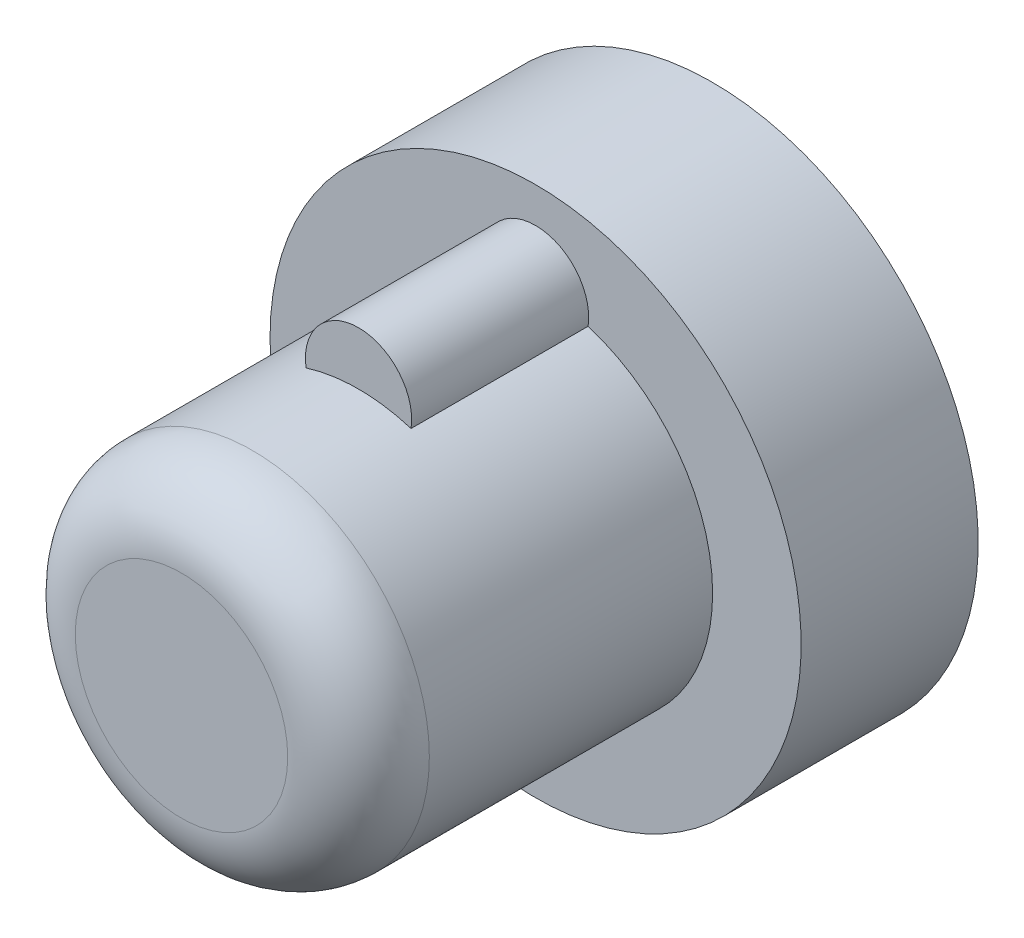
ISO-10303-21;
HEADER;
FILE_DESCRIPTION(('STEP AP214'),'2;1');
FILE_NAME('part.step','',(''),(''),'','','');
FILE_SCHEMA(('AUTOMOTIVE_DESIGN { 1 0 10303 214 1 1 1 1 }'));
ENDSEC;
DATA;
#1=APPLICATION_CONTEXT('core data for automotive mechanical design processes');
#2=APPLICATION_PROTOCOL_DEFINITION('international standard','automotive_design',2000,#1);
#3=PRODUCT_CONTEXT('',#1,'mechanical');
#4=PRODUCT('Part','Part','',(#3));
#5=PRODUCT_RELATED_PRODUCT_CATEGORY('part','',(#4));
#6=PRODUCT_DEFINITION_FORMATION('','',#4);
#7=PRODUCT_DEFINITION_CONTEXT('part definition',#1,'design');
#8=PRODUCT_DEFINITION('design','',#6,#7);
#9=PRODUCT_DEFINITION_SHAPE('','',#8);
#10=(LENGTH_UNIT() NAMED_UNIT(*) SI_UNIT(.MILLI.,.METRE.));
#11=(NAMED_UNIT(*) PLANE_ANGLE_UNIT() SI_UNIT($,.RADIAN.));
#12=(NAMED_UNIT(*) SI_UNIT($,.STERADIAN.) SOLID_ANGLE_UNIT());
#13=UNCERTAINTY_MEASURE_WITH_UNIT(LENGTH_MEASURE(1.E-05),#10,'distance_accuracy_value','');
#14=(GEOMETRIC_REPRESENTATION_CONTEXT(3) GLOBAL_UNCERTAINTY_ASSIGNED_CONTEXT((#13)) GLOBAL_UNIT_ASSIGNED_CONTEXT((#10,
#11,#12)) REPRESENTATION_CONTEXT('',''));
#15=CARTESIAN_POINT('',(0.,0.,0.));
#16=DIRECTION('',(0.,0.,1.));
#17=DIRECTION('',(1.,0.,0.));
#18=AXIS2_PLACEMENT_3D('',#15,#16,#17);
#19=CARTESIAN_POINT('',(0.,0.,10.));
#20=DIRECTION('',(0.,0.,-1.));
#21=DIRECTION('',(-1.,0.,0.));
#22=AXIS2_PLACEMENT_3D('',#19,#20,#21);
#23=CYLINDRICAL_SURFACE('',#22,5.);
#24=CARTESIAN_POINT('',(0.,0.,8.));
#25=DIRECTION('',(0.,0.,1.));
#26=DIRECTION('',(1.,0.,0.));
#27=AXIS2_PLACEMENT_3D('',#24,#25,#26);
#28=CIRCLE('',#27,5.);
#29=CARTESIAN_POINT('',(5.,0.,8.));
#30=VERTEX_POINT('',#29);
#31=EDGE_CURVE('E76',#30,#30,#28,.F.);
#32=ORIENTED_EDGE('',*,*,#31,.T.);
#33=EDGE_LOOP('',(#32));
#34=FACE_BOUND('',#33,.T.);
#35=DIRECTION('',(0.,0.,-1.));
#36=VECTOR('',#35,1.);
#37=CARTESIAN_POINT('',(1.48302899499639,4.775,2.5));
#38=LINE('',#37,#36);
#39=CARTESIAN_POINT('',(1.48302899499639,4.775,5.));
#40=VERTEX_POINT('',#39);
#41=CARTESIAN_POINT('',(1.48302899499639,4.775,0.));
#42=VERTEX_POINT('',#41);
#43=EDGE_CURVE('E55',#40,#42,#38,.T.);
#44=ORIENTED_EDGE('',*,*,#43,.F.);
#45=CARTESIAN_POINT('',(0.,0.,5.));
#46=DIRECTION('',(0.,0.,1.));
#47=DIRECTION('',(1.,0.,0.));
#48=AXIS2_PLACEMENT_3D('',#45,#46,#47);
#49=CIRCLE('',#48,5.);
#50=CARTESIAN_POINT('',(-1.48302899499639,4.775,5.));
#51=VERTEX_POINT('',#50);
#52=EDGE_CURVE('E11',#40,#51,#49,.T.);
#53=ORIENTED_EDGE('',*,*,#52,.T.);
#54=DIRECTION('',(0.,0.,-1.));
#55=VECTOR('',#54,1.);
#56=CARTESIAN_POINT('',(-1.48302899499639,4.775,2.5));
#57=LINE('',#56,#55);
#58=CARTESIAN_POINT('',(-1.48302899499639,4.775,0.));
#59=VERTEX_POINT('',#58);
#60=EDGE_CURVE('E69',#59,#51,#57,.F.);
#61=ORIENTED_EDGE('',*,*,#60,.F.);
#62=CARTESIAN_POINT('',(0.,0.,0.));
#63=DIRECTION('',(0.,0.,1.));
#64=DIRECTION('',(1.,0.,0.));
#65=AXIS2_PLACEMENT_3D('',#62,#63,#64);
#66=CIRCLE('',#65,5.);
#67=EDGE_CURVE('E62',#59,#42,#66,.T.);
#68=ORIENTED_EDGE('',*,*,#67,.T.);
#69=EDGE_LOOP('',(#44,#53,#61,#68));
#70=FACE_BOUND('',#69,.T.);
#71=ADVANCED_FACE('F37',(#34,#70),#23,.T.);
#72=CARTESIAN_POINT('',(0.,0.,10.));
#73=DIRECTION('',(0.,0.,1.));
#74=DIRECTION('',(1.,0.,0.));
#75=AXIS2_PLACEMENT_3D('',#72,#73,#74);
#76=PLANE('',#75);
#77=CARTESIAN_POINT('',(0.,0.,10.));
#78=DIRECTION('',(0.,0.,1.));
#79=DIRECTION('',(1.,0.,0.));
#80=AXIS2_PLACEMENT_3D('',#77,#78,#79);
#81=CIRCLE('',#80,3.);
#82=CARTESIAN_POINT('',(3.,0.,10.));
#83=VERTEX_POINT('',#82);
#84=EDGE_CURVE('E66',#83,#83,#81,.T.);
#85=ORIENTED_EDGE('',*,*,#84,.T.);
#86=EDGE_LOOP('',(#85));
#87=FACE_BOUND('',#86,.T.);
#88=ADVANCED_FACE('F97',(#87),#76,.T.);
#89=CARTESIAN_POINT('',(0.,0.,-5.));
#90=DIRECTION('',(0.,0.,1.));
#91=DIRECTION('',(1.,0.,0.));
#92=AXIS2_PLACEMENT_3D('',#89,#90,#91);
#93=CYLINDRICAL_SURFACE('',#92,7.5);
#94=CARTESIAN_POINT('',(0.,0.,-5.));
#95=DIRECTION('',(0.,0.,-1.));
#96=DIRECTION('',(-1.,0.,0.));
#97=AXIS2_PLACEMENT_3D('',#94,#95,#96);
#98=CIRCLE('',#97,7.5);
#99=CARTESIAN_POINT('',(-7.5,0.,-5.));
#100=VERTEX_POINT('',#99);
#101=EDGE_CURVE('E67',#100,#100,#98,.T.);
#102=ORIENTED_EDGE('',*,*,#101,.F.);
#103=EDGE_LOOP('',(#102));
#104=FACE_BOUND('',#103,.T.);
#105=CARTESIAN_POINT('',(0.,0.,0.));
#106=DIRECTION('',(0.,0.,-1.));
#107=DIRECTION('',(-1.,0.,0.));
#108=AXIS2_PLACEMENT_3D('',#105,#106,#107);
#109=CIRCLE('',#108,7.5);
#110=CARTESIAN_POINT('',(-7.5,0.,0.));
#111=VERTEX_POINT('',#110);
#112=EDGE_CURVE('E82',#111,#111,#109,.T.);
#113=ORIENTED_EDGE('',*,*,#112,.T.);
#114=EDGE_LOOP('',(#113));
#115=FACE_BOUND('',#114,.T.);
#116=ADVANCED_FACE('F102',(#104,#115),#93,.T.);
#117=CARTESIAN_POINT('',(0.,0.,-5.));
#118=DIRECTION('',(0.,0.,-1.));
#119=DIRECTION('',(-1.,0.,0.));
#120=AXIS2_PLACEMENT_3D('',#117,#118,#119);
#121=PLANE('',#120);
#122=ORIENTED_EDGE('',*,*,#101,.T.);
#123=EDGE_LOOP('',(#122));
#124=FACE_BOUND('',#123,.T.);
#125=ADVANCED_FACE('F108',(#124),#121,.T.);
#126=CARTESIAN_POINT('',(0.,0.,0.));
#127=DIRECTION('',(0.,0.,-1.));
#128=DIRECTION('',(-1.,0.,0.));
#129=AXIS2_PLACEMENT_3D('',#126,#127,#128);
#130=PLANE('',#129);
#131=CARTESIAN_POINT('',(0.,5.,0.));
#132=DIRECTION('',(0.,0.,-1.));
#133=DIRECTION('',(-1.,0.,0.));
#134=AXIS2_PLACEMENT_3D('',#131,#132,#133);
#135=CIRCLE('',#134,1.5);
#136=EDGE_CURVE('E45',#42,#59,#135,.F.);
#137=ORIENTED_EDGE('',*,*,#136,.F.);
#138=ORIENTED_EDGE('',*,*,#67,.F.);
#139=EDGE_LOOP('',(#137,#138));
#140=FACE_BOUND('',#139,.T.);
#141=ORIENTED_EDGE('',*,*,#112,.F.);
#142=EDGE_LOOP('',(#141));
#143=FACE_BOUND('',#142,.T.);
#144=ADVANCED_FACE('F63',(#140,#143),#130,.F.);
#145=CARTESIAN_POINT('',(0.,0.,8.));
#146=DIRECTION('',(0.,0.,1.));
#147=DIRECTION('',(1.,0.,0.));
#148=AXIS2_PLACEMENT_3D('',#145,#146,#147);
#149=TOROIDAL_SURFACE('',#148,3.,2.);
#150=ORIENTED_EDGE('',*,*,#31,.F.);
#151=EDGE_LOOP('',(#150));
#152=FACE_BOUND('',#151,.T.);
#153=ORIENTED_EDGE('',*,*,#84,.F.);
#154=EDGE_LOOP('',(#153));
#155=FACE_BOUND('',#154,.T.);
#156=ADVANCED_FACE('F39',(#152,#155),#149,.T.);
#157=CARTESIAN_POINT('',(0.,5.,5.));
#158=DIRECTION('',(0.,0.,-1.));
#159=DIRECTION('',(-1.,0.,0.));
#160=AXIS2_PLACEMENT_3D('',#157,#158,#159);
#161=CYLINDRICAL_SURFACE('',#160,1.5);
#162=CARTESIAN_POINT('',(0.,5.,5.));
#163=DIRECTION('',(0.,0.,1.));
#164=DIRECTION('',(1.,0.,0.));
#165=AXIS2_PLACEMENT_3D('',#162,#163,#164);
#166=CIRCLE('',#165,1.5);
#167=EDGE_CURVE('E73',#40,#51,#166,.T.);
#168=ORIENTED_EDGE('',*,*,#167,.F.);
#169=ORIENTED_EDGE('',*,*,#43,.T.);
#170=ORIENTED_EDGE('',*,*,#136,.T.);
#171=ORIENTED_EDGE('',*,*,#60,.T.);
#172=EDGE_LOOP('',(#168,#169,#170,#171));
#173=FACE_BOUND('',#172,.T.);
#174=ADVANCED_FACE('F75',(#173),#161,.T.);
#175=CARTESIAN_POINT('',(0.,5.,5.));
#176=DIRECTION('',(0.,0.,1.));
#177=DIRECTION('',(1.,0.,0.));
#178=AXIS2_PLACEMENT_3D('',#175,#176,#177);
#179=PLANE('',#178);
#180=ORIENTED_EDGE('',*,*,#52,.F.);
#181=ORIENTED_EDGE('',*,*,#167,.T.);
#182=EDGE_LOOP('',(#180,#181));
#183=FACE_BOUND('',#182,.T.);
#184=ADVANCED_FACE('F89',(#183),#179,.T.);
#185=CLOSED_SHELL('',(#71,#88,#116,#125,#144,#156,#174,#184));
#186=MANIFOLD_SOLID_BREP('B2',#185);
#187=ADVANCED_BREP_SHAPE_REPRESENTATION('',(#18,#186),#14);
#188=SHAPE_DEFINITION_REPRESENTATION(#9,#187);
ENDSEC;
END-ISO-10303-21;
